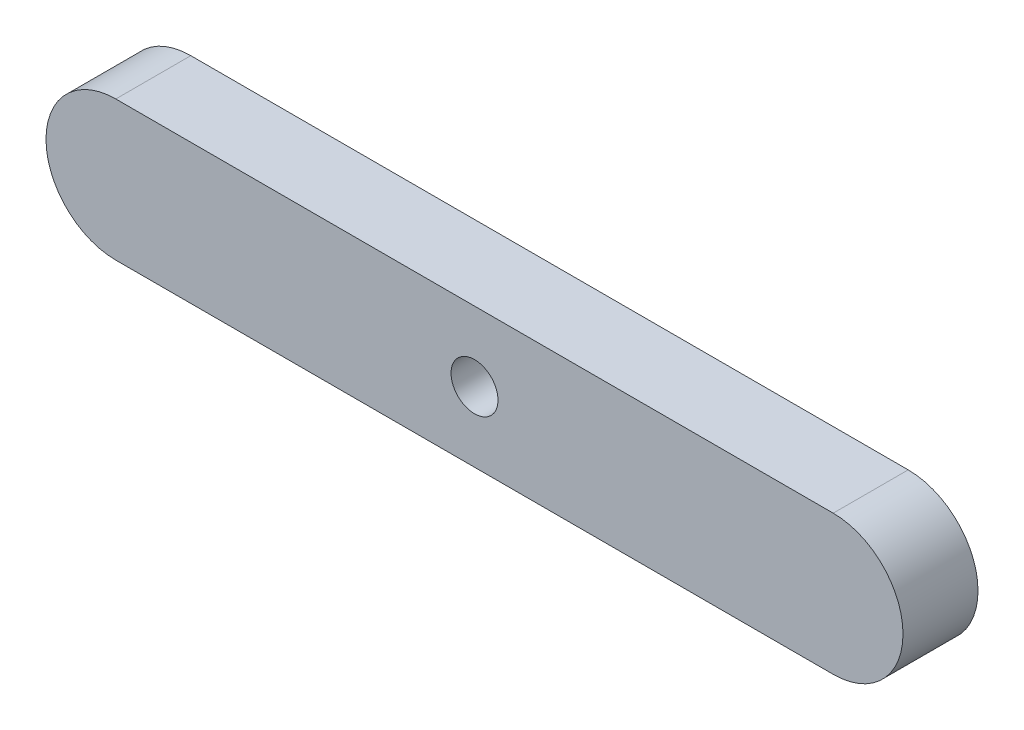
ISO-10303-21;
HEADER;
FILE_DESCRIPTION(('STEP AP214'),'2;1');
FILE_NAME('part.step','',(''),(''),'','','');
FILE_SCHEMA(('AUTOMOTIVE_DESIGN { 1 0 10303 214 1 1 1 1 }'));
ENDSEC;
DATA;
#1=APPLICATION_CONTEXT('core data for automotive mechanical design processes');
#2=APPLICATION_PROTOCOL_DEFINITION('international standard','automotive_design',2000,#1);
#3=PRODUCT_CONTEXT('',#1,'mechanical');
#4=PRODUCT('Part','Part','',(#3));
#5=PRODUCT_RELATED_PRODUCT_CATEGORY('part','',(#4));
#6=PRODUCT_DEFINITION_FORMATION('','',#4);
#7=PRODUCT_DEFINITION_CONTEXT('part definition',#1,'design');
#8=PRODUCT_DEFINITION('design','',#6,#7);
#9=PRODUCT_DEFINITION_SHAPE('','',#8);
#10=(LENGTH_UNIT() NAMED_UNIT(*) SI_UNIT(.MILLI.,.METRE.));
#11=(NAMED_UNIT(*) PLANE_ANGLE_UNIT() SI_UNIT($,.RADIAN.));
#12=(NAMED_UNIT(*) SI_UNIT($,.STERADIAN.) SOLID_ANGLE_UNIT());
#13=UNCERTAINTY_MEASURE_WITH_UNIT(LENGTH_MEASURE(1.E-05),#10,'distance_accuracy_value','');
#14=(GEOMETRIC_REPRESENTATION_CONTEXT(3) GLOBAL_UNCERTAINTY_ASSIGNED_CONTEXT((#13)) GLOBAL_UNIT_ASSIGNED_CONTEXT((#10,
#11,#12)) REPRESENTATION_CONTEXT('',''));
#15=CARTESIAN_POINT('',(0.,0.,0.));
#16=DIRECTION('',(0.,0.,1.));
#17=DIRECTION('',(1.,0.,0.));
#18=AXIS2_PLACEMENT_3D('',#15,#16,#17);
#19=CARTESIAN_POINT('',(41.1168571407103,0.,10.));
#20=DIRECTION('',(0.,0.,-1.));
#21=DIRECTION('',(-1.,0.,0.));
#22=AXIS2_PLACEMENT_3D('',#19,#20,#21);
#23=CYLINDRICAL_SURFACE('',#22,9.30539398447655);
#24=CARTESIAN_POINT('',(41.1168571407103,0.,0.));
#25=DIRECTION('',(0.,0.,1.));
#26=DIRECTION('',(1.,0.,0.));
#27=AXIS2_PLACEMENT_3D('',#24,#25,#26);
#28=CIRCLE('',#27,9.30539398447655);
#29=CARTESIAN_POINT('',(41.1168571407103,-9.30539398447655,0.));
#30=VERTEX_POINT('',#29);
#31=CARTESIAN_POINT('',(41.1168571407103,9.30539398447655,0.));
#32=VERTEX_POINT('',#31);
#33=EDGE_CURVE('E110',#30,#32,#28,.T.);
#34=ORIENTED_EDGE('',*,*,#33,.T.);
#35=DIRECTION('',(0.,0.,-1.));
#36=VECTOR('',#35,1.);
#37=CARTESIAN_POINT('',(41.1168571407103,9.30539398447655,10.));
#38=LINE('',#37,#36);
#39=CARTESIAN_POINT('',(41.1168571407103,9.30539398447655,10.));
#40=VERTEX_POINT('',#39);
#41=EDGE_CURVE('E11',#40,#32,#38,.T.);
#42=ORIENTED_EDGE('',*,*,#41,.F.);
#43=CARTESIAN_POINT('',(41.1168571407103,0.,10.));
#44=DIRECTION('',(0.,0.,1.));
#45=DIRECTION('',(1.,0.,0.));
#46=AXIS2_PLACEMENT_3D('',#43,#44,#45);
#47=CIRCLE('',#46,9.30539398447655);
#48=CARTESIAN_POINT('',(41.1168571407103,-9.30539398447655,10.));
#49=VERTEX_POINT('',#48);
#50=EDGE_CURVE('E93',#49,#40,#47,.T.);
#51=ORIENTED_EDGE('',*,*,#50,.F.);
#52=DIRECTION('',(0.,0.,-1.));
#53=VECTOR('',#52,1.);
#54=CARTESIAN_POINT('',(41.1168571407103,-9.30539398447655,10.));
#55=LINE('',#54,#53);
#56=EDGE_CURVE('E106',#49,#30,#55,.T.);
#57=ORIENTED_EDGE('',*,*,#56,.T.);
#58=EDGE_LOOP('',(#34,#42,#51,#57));
#59=FACE_BOUND('',#58,.T.);
#60=ADVANCED_FACE('F40',(#59),#23,.T.);
#61=CARTESIAN_POINT('',(41.1168571407103,9.30539398447655,10.));
#62=DIRECTION('',(0.,-1.,0.));
#63=DIRECTION('',(0.,0.,-1.));
#64=AXIS2_PLACEMENT_3D('',#61,#62,#63);
#65=PLANE('',#64);
#66=DIRECTION('',(-1.,0.,0.));
#67=VECTOR('',#66,1.);
#68=CARTESIAN_POINT('',(41.1168571407103,9.30539398447655,0.));
#69=LINE('',#68,#67);
#70=CARTESIAN_POINT('',(-54.5339368392579,9.30539398447655,0.));
#71=VERTEX_POINT('',#70);
#72=EDGE_CURVE('E98',#32,#71,#69,.T.);
#73=ORIENTED_EDGE('',*,*,#72,.T.);
#74=DIRECTION('',(0.,0.,-1.));
#75=VECTOR('',#74,1.);
#76=CARTESIAN_POINT('',(-54.5339368392579,9.30539398447655,10.));
#77=LINE('',#76,#75);
#78=CARTESIAN_POINT('',(-54.5339368392579,9.30539398447655,10.));
#79=VERTEX_POINT('',#78);
#80=EDGE_CURVE('E50',#79,#71,#77,.T.);
#81=ORIENTED_EDGE('',*,*,#80,.F.);
#82=DIRECTION('',(-1.,0.,0.));
#83=VECTOR('',#82,1.);
#84=CARTESIAN_POINT('',(41.1168571407103,9.30539398447655,10.));
#85=LINE('',#84,#83);
#86=EDGE_CURVE('E88',#40,#79,#85,.T.);
#87=ORIENTED_EDGE('',*,*,#86,.F.);
#88=ORIENTED_EDGE('',*,*,#41,.T.);
#89=EDGE_LOOP('',(#73,#81,#87,#88));
#90=FACE_BOUND('',#89,.T.);
#91=ADVANCED_FACE('F97',(#90),#65,.F.);
#92=CARTESIAN_POINT('',(-54.5339368392579,0.,10.));
#93=DIRECTION('',(0.,0.,-1.));
#94=DIRECTION('',(-1.,0.,0.));
#95=AXIS2_PLACEMENT_3D('',#92,#93,#94);
#96=CYLINDRICAL_SURFACE('',#95,9.30539398447655);
#97=CARTESIAN_POINT('',(-54.5339368392579,0.,0.));
#98=DIRECTION('',(0.,0.,1.));
#99=DIRECTION('',(1.,0.,0.));
#100=AXIS2_PLACEMENT_3D('',#97,#98,#99);
#101=CIRCLE('',#100,9.30539398447655);
#102=CARTESIAN_POINT('',(-54.5339368392579,-9.30539398447655,0.));
#103=VERTEX_POINT('',#102);
#104=EDGE_CURVE('E75',#71,#103,#101,.T.);
#105=ORIENTED_EDGE('',*,*,#104,.T.);
#106=DIRECTION('',(0.,0.,-1.));
#107=VECTOR('',#106,1.);
#108=CARTESIAN_POINT('',(-54.5339368392579,-9.30539398447655,10.));
#109=LINE('',#108,#107);
#110=CARTESIAN_POINT('',(-54.5339368392579,-9.30539398447655,10.));
#111=VERTEX_POINT('',#110);
#112=EDGE_CURVE('E100',#111,#103,#109,.T.);
#113=ORIENTED_EDGE('',*,*,#112,.F.);
#114=CARTESIAN_POINT('',(-54.5339368392579,0.,10.));
#115=DIRECTION('',(0.,0.,1.));
#116=DIRECTION('',(1.,0.,0.));
#117=AXIS2_PLACEMENT_3D('',#114,#115,#116);
#118=CIRCLE('',#117,9.30539398447655);
#119=EDGE_CURVE('E91',#79,#111,#118,.T.);
#120=ORIENTED_EDGE('',*,*,#119,.F.);
#121=ORIENTED_EDGE('',*,*,#80,.T.);
#122=EDGE_LOOP('',(#105,#113,#120,#121));
#123=FACE_BOUND('',#122,.T.);
#124=ADVANCED_FACE('F102',(#123),#96,.T.);
#125=CARTESIAN_POINT('',(41.1168571407103,-9.30539398447655,10.));
#126=DIRECTION('',(0.,1.,0.));
#127=DIRECTION('',(0.,0.,1.));
#128=AXIS2_PLACEMENT_3D('',#125,#126,#127);
#129=PLANE('',#128);
#130=DIRECTION('',(1.,0.,0.));
#131=VECTOR('',#130,1.);
#132=CARTESIAN_POINT('',(41.1168571407103,-9.30539398447655,0.));
#133=LINE('',#132,#131);
#134=EDGE_CURVE('E81',#103,#30,#133,.T.);
#135=ORIENTED_EDGE('',*,*,#134,.T.);
#136=ORIENTED_EDGE('',*,*,#56,.F.);
#137=DIRECTION('',(1.,0.,0.));
#138=VECTOR('',#137,1.);
#139=CARTESIAN_POINT('',(41.1168571407103,-9.30539398447655,10.));
#140=LINE('',#139,#138);
#141=EDGE_CURVE('E58',#111,#49,#140,.T.);
#142=ORIENTED_EDGE('',*,*,#141,.F.);
#143=ORIENTED_EDGE('',*,*,#112,.T.);
#144=EDGE_LOOP('',(#135,#136,#142,#143));
#145=FACE_BOUND('',#144,.T.);
#146=ADVANCED_FACE('F123',(#145),#129,.F.);
#147=CARTESIAN_POINT('',(41.1168571407103,0.,10.));
#148=DIRECTION('',(0.,0.,1.));
#149=DIRECTION('',(1.,0.,0.));
#150=AXIS2_PLACEMENT_3D('',#147,#148,#149);
#151=PLANE('',#150);
#152=CARTESIAN_POINT('',(-6.7085398492738,0.,10.));
#153=DIRECTION('',(0.,0.,1.));
#154=DIRECTION('',(1.,0.,0.));
#155=AXIS2_PLACEMENT_3D('',#152,#153,#154);
#156=CIRCLE('',#155,3.12969743576692);
#157=CARTESIAN_POINT('',(-3.57884241350689,0.,10.));
#158=VERTEX_POINT('',#157);
#159=EDGE_CURVE('E130',#158,#158,#156,.T.);
#160=ORIENTED_EDGE('',*,*,#159,.F.);
#161=EDGE_LOOP('',(#160));
#162=FACE_BOUND('',#161,.T.);
#163=ORIENTED_EDGE('',*,*,#50,.T.);
#164=ORIENTED_EDGE('',*,*,#86,.T.);
#165=ORIENTED_EDGE('',*,*,#119,.T.);
#166=ORIENTED_EDGE('',*,*,#141,.T.);
#167=EDGE_LOOP('',(#163,#164,#165,#166));
#168=FACE_BOUND('',#167,.T.);
#169=ADVANCED_FACE('F89',(#162,#168),#151,.T.);
#170=CARTESIAN_POINT('',(41.1168571407103,0.,0.));
#171=DIRECTION('',(0.,0.,1.));
#172=DIRECTION('',(1.,0.,0.));
#173=AXIS2_PLACEMENT_3D('',#170,#171,#172);
#174=PLANE('',#173);
#175=CARTESIAN_POINT('',(-6.7085398492738,0.,0.));
#176=DIRECTION('',(0.,0.,1.));
#177=DIRECTION('',(1.,0.,0.));
#178=AXIS2_PLACEMENT_3D('',#175,#176,#177);
#179=CIRCLE('',#178,3.12969743576692);
#180=CARTESIAN_POINT('',(-3.57884241350689,0.,0.));
#181=VERTEX_POINT('',#180);
#182=EDGE_CURVE('E43',#181,#181,#179,.T.);
#183=ORIENTED_EDGE('',*,*,#182,.T.);
#184=EDGE_LOOP('',(#183));
#185=FACE_BOUND('',#184,.T.);
#186=ORIENTED_EDGE('',*,*,#33,.F.);
#187=ORIENTED_EDGE('',*,*,#134,.F.);
#188=ORIENTED_EDGE('',*,*,#104,.F.);
#189=ORIENTED_EDGE('',*,*,#72,.F.);
#190=EDGE_LOOP('',(#186,#187,#188,#189));
#191=FACE_BOUND('',#190,.T.);
#192=ADVANCED_FACE('F126',(#185,#191),#174,.F.);
#193=CARTESIAN_POINT('',(-6.7085398492738,0.,-14.));
#194=DIRECTION('',(0.,0.,1.));
#195=DIRECTION('',(1.,0.,0.));
#196=AXIS2_PLACEMENT_3D('',#193,#194,#195);
#197=CYLINDRICAL_SURFACE('',#196,3.12969743576692);
#198=ORIENTED_EDGE('',*,*,#159,.T.);
#199=EDGE_LOOP('',(#198));
#200=FACE_BOUND('',#199,.T.);
#201=ORIENTED_EDGE('',*,*,#182,.F.);
#202=EDGE_LOOP('',(#201));
#203=FACE_BOUND('',#202,.T.);
#204=ADVANCED_FACE('F140',(#200,#203),#197,.F.);
#205=CLOSED_SHELL('',(#60,#91,#124,#146,#169,#192,#204));
#206=MANIFOLD_SOLID_BREP('B2',#205);
#207=ADVANCED_BREP_SHAPE_REPRESENTATION('',(#18,#206),#14);
#208=SHAPE_DEFINITION_REPRESENTATION(#9,#207);
ENDSEC;
END-ISO-10303-21;
